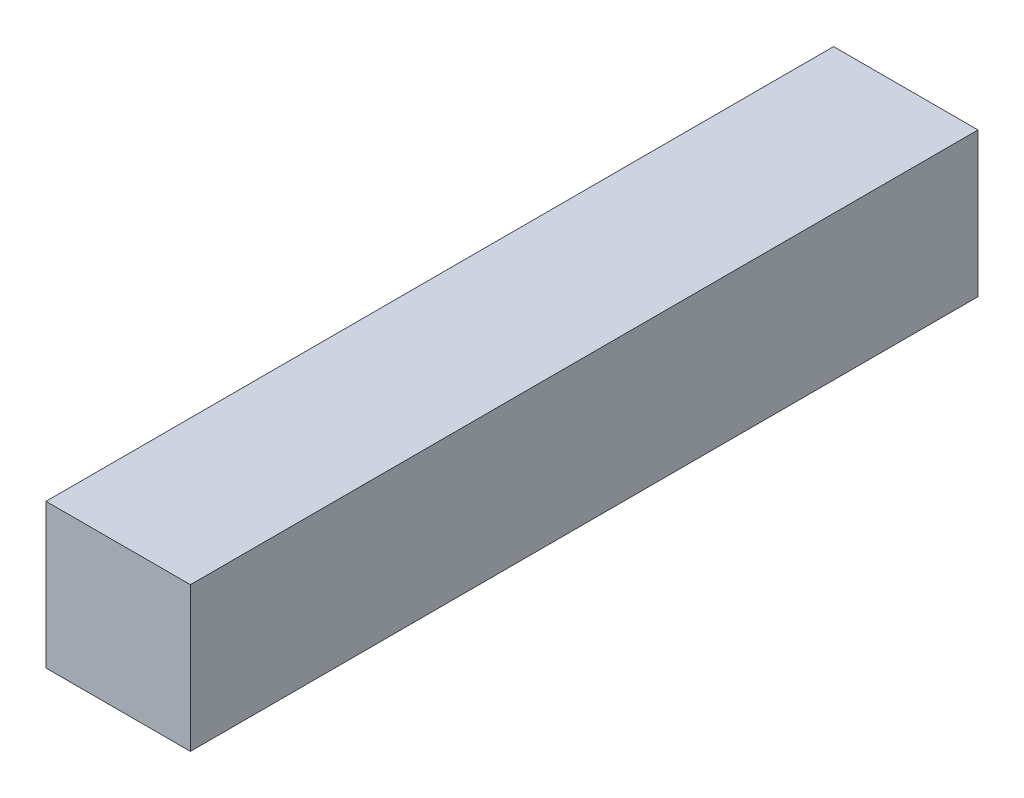
ISO-10303-21;
HEADER;
FILE_DESCRIPTION(('STEP AP214'),'2;1');
FILE_NAME('part.step','',(''),(''),'','','');
FILE_SCHEMA(('AUTOMOTIVE_DESIGN { 1 0 10303 214 1 1 1 1 }'));
ENDSEC;
DATA;
#1=APPLICATION_CONTEXT('core data for automotive mechanical design processes');
#2=APPLICATION_PROTOCOL_DEFINITION('international standard','automotive_design',2000,#1);
#3=PRODUCT_CONTEXT('',#1,'mechanical');
#4=PRODUCT('Part','Part','',(#3));
#5=PRODUCT_RELATED_PRODUCT_CATEGORY('part','',(#4));
#6=PRODUCT_DEFINITION_FORMATION('','',#4);
#7=PRODUCT_DEFINITION_CONTEXT('part definition',#1,'design');
#8=PRODUCT_DEFINITION('design','',#6,#7);
#9=PRODUCT_DEFINITION_SHAPE('','',#8);
#10=(LENGTH_UNIT() NAMED_UNIT(*) SI_UNIT(.MILLI.,.METRE.));
#11=(NAMED_UNIT(*) PLANE_ANGLE_UNIT() SI_UNIT($,.RADIAN.));
#12=(NAMED_UNIT(*) SI_UNIT($,.STERADIAN.) SOLID_ANGLE_UNIT());
#13=UNCERTAINTY_MEASURE_WITH_UNIT(LENGTH_MEASURE(1.E-05),#10,'distance_accuracy_value','');
#14=(GEOMETRIC_REPRESENTATION_CONTEXT(3) GLOBAL_UNCERTAINTY_ASSIGNED_CONTEXT((#13)) GLOBAL_UNIT_ASSIGNED_CONTEXT((#10,
#11,#12)) REPRESENTATION_CONTEXT('',''));
#15=CARTESIAN_POINT('',(0.,0.,0.));
#16=DIRECTION('',(0.,0.,1.));
#17=DIRECTION('',(1.,0.,0.));
#18=AXIS2_PLACEMENT_3D('',#15,#16,#17);
#19=CARTESIAN_POINT('',(-6.35,-6.35,381.));
#20=DIRECTION('',(0.,1.,0.));
#21=DIRECTION('',(0.,0.,1.));
#22=AXIS2_PLACEMENT_3D('',#19,#20,#21);
#23=PLANE('',#22);
#24=CARTESIAN_POINT('',(28.575,-6.35,349.25));
#25=DIRECTION('',(0.,-1.,0.));
#26=DIRECTION('',(0.,0.,-1.));
#27=AXIS2_PLACEMENT_3D('',#24,#25,#26);
#28=CIRCLE('',#27,6.35);
#29=CARTESIAN_POINT('',(28.575,-6.35,342.9));
#30=VERTEX_POINT('',#29);
#31=EDGE_CURVE('E212',#30,#30,#28,.T.);
#32=ORIENTED_EDGE('',*,*,#31,.F.);
#33=EDGE_LOOP('',(#32));
#34=FACE_BOUND('',#33,.T.);
#35=DIRECTION('',(1.,0.,0.));
#36=VECTOR('',#35,1.);
#37=CARTESIAN_POINT('',(-6.35,-6.35,0.));
#38=LINE('',#37,#36);
#39=CARTESIAN_POINT('',(-6.35,-6.35,0.));
#40=VERTEX_POINT('',#39);
#41=CARTESIAN_POINT('',(63.5,-6.35,0.));
#42=VERTEX_POINT('',#41);
#43=EDGE_CURVE('E161',#40,#42,#38,.T.);
#44=ORIENTED_EDGE('',*,*,#43,.T.);
#45=DIRECTION('',(0.,0.,-1.));
#46=VECTOR('',#45,1.);
#47=CARTESIAN_POINT('',(63.5,-6.35,381.));
#48=LINE('',#47,#46);
#49=CARTESIAN_POINT('',(63.5,-6.35,381.));
#50=VERTEX_POINT('',#49);
#51=EDGE_CURVE('E12',#50,#42,#48,.T.);
#52=ORIENTED_EDGE('',*,*,#51,.F.);
#53=DIRECTION('',(1.,0.,0.));
#54=VECTOR('',#53,1.);
#55=CARTESIAN_POINT('',(-6.35,-6.35,381.));
#56=LINE('',#55,#54);
#57=CARTESIAN_POINT('',(-6.35,-6.35,381.));
#58=VERTEX_POINT('',#57);
#59=EDGE_CURVE('E162',#58,#50,#56,.T.);
#60=ORIENTED_EDGE('',*,*,#59,.F.);
#61=DIRECTION('',(0.,0.,-1.));
#62=VECTOR('',#61,1.);
#63=CARTESIAN_POINT('',(-6.35,-6.35,381.));
#64=LINE('',#63,#62);
#65=EDGE_CURVE('E65',#58,#40,#64,.T.);
#66=ORIENTED_EDGE('',*,*,#65,.T.);
#67=EDGE_LOOP('',(#44,#52,#60,#66));
#68=FACE_BOUND('',#67,.T.);
#69=ADVANCED_FACE('F41',(#34,#68),#23,.F.);
#70=CARTESIAN_POINT('',(63.5,-6.35,381.));
#71=DIRECTION('',(-1.,0.,0.));
#72=DIRECTION('',(0.,0.,1.));
#73=AXIS2_PLACEMENT_3D('',#70,#71,#72);
#74=PLANE('',#73);
#75=DIRECTION('',(0.,1.,0.));
#76=VECTOR('',#75,1.);
#77=CARTESIAN_POINT('',(63.5,-6.35,0.));
#78=LINE('',#77,#76);
#79=CARTESIAN_POINT('',(63.5,63.5,0.));
#80=VERTEX_POINT('',#79);
#81=EDGE_CURVE('E177',#42,#80,#78,.T.);
#82=ORIENTED_EDGE('',*,*,#81,.T.);
#83=DIRECTION('',(0.,0.,-1.));
#84=VECTOR('',#83,1.);
#85=CARTESIAN_POINT('',(63.5,63.5,381.));
#86=LINE('',#85,#84);
#87=CARTESIAN_POINT('',(63.5,63.5,381.));
#88=VERTEX_POINT('',#87);
#89=EDGE_CURVE('E49',#88,#80,#86,.T.);
#90=ORIENTED_EDGE('',*,*,#89,.F.);
#91=DIRECTION('',(0.,1.,0.));
#92=VECTOR('',#91,1.);
#93=CARTESIAN_POINT('',(63.5,-6.35,381.));
#94=LINE('',#93,#92);
#95=EDGE_CURVE('E91',#50,#88,#94,.T.);
#96=ORIENTED_EDGE('',*,*,#95,.F.);
#97=ORIENTED_EDGE('',*,*,#51,.T.);
#98=EDGE_LOOP('',(#82,#90,#96,#97));
#99=FACE_BOUND('',#98,.T.);
#100=ADVANCED_FACE('F197',(#99),#74,.F.);
#101=CARTESIAN_POINT('',(-6.35,63.5,381.));
#102=DIRECTION('',(0.,1.,0.));
#103=DIRECTION('',(0.,0.,1.));
#104=AXIS2_PLACEMENT_3D('',#101,#102,#103);
#105=PLANE('',#104);
#106=DIRECTION('',(1.,0.,0.));
#107=VECTOR('',#106,1.);
#108=CARTESIAN_POINT('',(-6.35,63.5,0.));
#109=LINE('',#108,#107);
#110=CARTESIAN_POINT('',(-6.35,63.5,0.));
#111=VERTEX_POINT('',#110);
#112=EDGE_CURVE('E181',#111,#80,#109,.T.);
#113=ORIENTED_EDGE('',*,*,#112,.F.);
#114=DIRECTION('',(0.,0.,-1.));
#115=VECTOR('',#114,1.);
#116=CARTESIAN_POINT('',(-6.35,63.5,381.));
#117=LINE('',#116,#115);
#118=CARTESIAN_POINT('',(-6.35,63.5,381.));
#119=VERTEX_POINT('',#118);
#120=EDGE_CURVE('E190',#119,#111,#117,.T.);
#121=ORIENTED_EDGE('',*,*,#120,.F.);
#122=DIRECTION('',(1.,0.,0.));
#123=VECTOR('',#122,1.);
#124=CARTESIAN_POINT('',(-6.35,63.5,381.));
#125=LINE('',#124,#123);
#126=EDGE_CURVE('E168',#119,#88,#125,.T.);
#127=ORIENTED_EDGE('',*,*,#126,.T.);
#128=ORIENTED_EDGE('',*,*,#89,.T.);
#129=EDGE_LOOP('',(#113,#121,#127,#128));
#130=FACE_BOUND('',#129,.T.);
#131=ADVANCED_FACE('F195',(#130),#105,.T.);
#132=CARTESIAN_POINT('',(-6.35,-6.35,381.));
#133=DIRECTION('',(-1.,0.,0.));
#134=DIRECTION('',(0.,0.,1.));
#135=AXIS2_PLACEMENT_3D('',#132,#133,#134);
#136=PLANE('',#135);
#137=DIRECTION('',(0.,1.,0.));
#138=VECTOR('',#137,1.);
#139=CARTESIAN_POINT('',(-6.35,-6.35,0.));
#140=LINE('',#139,#138);
#141=EDGE_CURVE('E165',#40,#111,#140,.T.);
#142=ORIENTED_EDGE('',*,*,#141,.F.);
#143=ORIENTED_EDGE('',*,*,#65,.F.);
#144=DIRECTION('',(0.,1.,0.));
#145=VECTOR('',#144,1.);
#146=CARTESIAN_POINT('',(-6.35,-6.35,381.));
#147=LINE('',#146,#145);
#148=EDGE_CURVE('E172',#58,#119,#147,.T.);
#149=ORIENTED_EDGE('',*,*,#148,.T.);
#150=ORIENTED_EDGE('',*,*,#120,.T.);
#151=EDGE_LOOP('',(#142,#143,#149,#150));
#152=FACE_BOUND('',#151,.T.);
#153=ADVANCED_FACE('F201',(#152),#136,.T.);
#154=CARTESIAN_POINT('',(0.,0.,381.));
#155=DIRECTION('',(0.,0.,1.));
#156=DIRECTION('',(1.,0.,0.));
#157=AXIS2_PLACEMENT_3D('',#154,#155,#156);
#158=PLANE('',#157);
#159=ORIENTED_EDGE('',*,*,#59,.T.);
#160=ORIENTED_EDGE('',*,*,#95,.T.);
#161=ORIENTED_EDGE('',*,*,#126,.F.);
#162=ORIENTED_EDGE('',*,*,#148,.F.);
#163=EDGE_LOOP('',(#159,#160,#161,#162));
#164=FACE_BOUND('',#163,.T.);
#165=ADVANCED_FACE('F204',(#164),#158,.T.);
#166=CARTESIAN_POINT('',(0.,0.,0.));
#167=DIRECTION('',(0.,0.,1.));
#168=DIRECTION('',(1.,0.,0.));
#169=AXIS2_PLACEMENT_3D('',#166,#167,#168);
#170=PLANE('',#169);
#171=DIRECTION('',(0.,1.,0.));
#172=VECTOR('',#171,1.);
#173=CARTESIAN_POINT('',(57.15,0.,0.));
#174=LINE('',#173,#172);
#175=CARTESIAN_POINT('',(57.15,0.,0.));
#176=VERTEX_POINT('',#175);
#177=CARTESIAN_POINT('',(57.15,57.15,0.));
#178=VERTEX_POINT('',#177);
#179=EDGE_CURVE('E156',#176,#178,#174,.T.);
#180=ORIENTED_EDGE('',*,*,#179,.T.);
#181=DIRECTION('',(1.,0.,0.));
#182=VECTOR('',#181,1.);
#183=CARTESIAN_POINT('',(0.,57.15,0.));
#184=LINE('',#183,#182);
#185=CARTESIAN_POINT('',(0.,57.15,0.));
#186=VERTEX_POINT('',#185);
#187=EDGE_CURVE('E134',#186,#178,#184,.T.);
#188=ORIENTED_EDGE('',*,*,#187,.F.);
#189=DIRECTION('',(0.,1.,0.));
#190=VECTOR('',#189,1.);
#191=CARTESIAN_POINT('',(0.,0.,0.));
#192=LINE('',#191,#190);
#193=CARTESIAN_POINT('',(0.,0.,0.));
#194=VERTEX_POINT('',#193);
#195=EDGE_CURVE('E126',#194,#186,#192,.T.);
#196=ORIENTED_EDGE('',*,*,#195,.F.);
#197=DIRECTION('',(1.,0.,0.));
#198=VECTOR('',#197,1.);
#199=CARTESIAN_POINT('',(0.,0.,0.));
#200=LINE('',#199,#198);
#201=EDGE_CURVE('E56',#194,#176,#200,.T.);
#202=ORIENTED_EDGE('',*,*,#201,.T.);
#203=EDGE_LOOP('',(#180,#188,#196,#202));
#204=FACE_BOUND('',#203,.T.);
#205=ORIENTED_EDGE('',*,*,#43,.F.);
#206=ORIENTED_EDGE('',*,*,#141,.T.);
#207=ORIENTED_EDGE('',*,*,#112,.T.);
#208=ORIENTED_EDGE('',*,*,#81,.F.);
#209=EDGE_LOOP('',(#205,#206,#207,#208));
#210=FACE_BOUND('',#209,.T.);
#211=ADVANCED_FACE('F200',(#204,#210),#170,.F.);
#212=CARTESIAN_POINT('',(0.,0.,374.65));
#213=DIRECTION('',(0.,0.,1.));
#214=DIRECTION('',(1.,0.,0.));
#215=AXIS2_PLACEMENT_3D('',#212,#213,#214);
#216=PLANE('',#215);
#217=DIRECTION('',(0.,1.,0.));
#218=VECTOR('',#217,1.);
#219=CARTESIAN_POINT('',(0.,0.,374.65));
#220=LINE('',#219,#218);
#221=CARTESIAN_POINT('',(0.,0.,374.65));
#222=VERTEX_POINT('',#221);
#223=CARTESIAN_POINT('',(0.,57.15,374.65));
#224=VERTEX_POINT('',#223);
#225=EDGE_CURVE('E139',#222,#224,#220,.T.);
#226=ORIENTED_EDGE('',*,*,#225,.T.);
#227=DIRECTION('',(1.,0.,0.));
#228=VECTOR('',#227,1.);
#229=CARTESIAN_POINT('',(0.,57.15,374.65));
#230=LINE('',#229,#228);
#231=CARTESIAN_POINT('',(57.15,57.15,374.65));
#232=VERTEX_POINT('',#231);
#233=EDGE_CURVE('E131',#224,#232,#230,.T.);
#234=ORIENTED_EDGE('',*,*,#233,.T.);
#235=DIRECTION('',(0.,1.,0.));
#236=VECTOR('',#235,1.);
#237=CARTESIAN_POINT('',(57.15,0.,374.65));
#238=LINE('',#237,#236);
#239=CARTESIAN_POINT('',(57.15,0.,374.65));
#240=VERTEX_POINT('',#239);
#241=EDGE_CURVE('E115',#240,#232,#238,.T.);
#242=ORIENTED_EDGE('',*,*,#241,.F.);
#243=DIRECTION('',(1.,0.,0.));
#244=VECTOR('',#243,1.);
#245=CARTESIAN_POINT('',(0.,0.,374.65));
#246=LINE('',#245,#244);
#247=EDGE_CURVE('E127',#222,#240,#246,.T.);
#248=ORIENTED_EDGE('',*,*,#247,.F.);
#249=EDGE_LOOP('',(#226,#234,#242,#248));
#250=FACE_BOUND('',#249,.T.);
#251=ADVANCED_FACE('F138',(#250),#216,.F.);
#252=CARTESIAN_POINT('',(0.,57.15,461.822305089622));
#253=DIRECTION('',(0.,1.,0.));
#254=DIRECTION('',(0.,0.,1.));
#255=AXIS2_PLACEMENT_3D('',#252,#253,#254);
#256=PLANE('',#255);
#257=DIRECTION('',(0.,0.,-1.));
#258=VECTOR('',#257,1.);
#259=CARTESIAN_POINT('',(0.,57.15,461.822305089622));
#260=LINE('',#259,#258);
#261=EDGE_CURVE('E149',#224,#186,#260,.T.);
#262=ORIENTED_EDGE('',*,*,#261,.T.);
#263=ORIENTED_EDGE('',*,*,#187,.T.);
#264=DIRECTION('',(0.,0.,-1.));
#265=VECTOR('',#264,1.);
#266=CARTESIAN_POINT('',(57.15,57.15,461.822305089622));
#267=LINE('',#266,#265);
#268=EDGE_CURVE('E119',#232,#178,#267,.T.);
#269=ORIENTED_EDGE('',*,*,#268,.F.);
#270=ORIENTED_EDGE('',*,*,#233,.F.);
#271=EDGE_LOOP('',(#262,#263,#269,#270));
#272=FACE_BOUND('',#271,.T.);
#273=ADVANCED_FACE('F130',(#272),#256,.F.);
#274=CARTESIAN_POINT('',(57.15,0.,461.822305089622));
#275=DIRECTION('',(-1.,0.,0.));
#276=DIRECTION('',(0.,0.,1.));
#277=AXIS2_PLACEMENT_3D('',#274,#275,#276);
#278=PLANE('',#277);
#279=ORIENTED_EDGE('',*,*,#241,.T.);
#280=ORIENTED_EDGE('',*,*,#268,.T.);
#281=ORIENTED_EDGE('',*,*,#179,.F.);
#282=DIRECTION('',(0.,0.,-1.));
#283=VECTOR('',#282,1.);
#284=CARTESIAN_POINT('',(57.15,0.,461.822305089622));
#285=LINE('',#284,#283);
#286=EDGE_CURVE('E121',#240,#176,#285,.T.);
#287=ORIENTED_EDGE('',*,*,#286,.F.);
#288=EDGE_LOOP('',(#279,#280,#281,#287));
#289=FACE_BOUND('',#288,.T.);
#290=ADVANCED_FACE('F117',(#289),#278,.T.);
#291=CARTESIAN_POINT('',(0.,0.,461.822305089622));
#292=DIRECTION('',(0.,1.,0.));
#293=DIRECTION('',(0.,0.,1.));
#294=AXIS2_PLACEMENT_3D('',#291,#292,#293);
#295=PLANE('',#294);
#296=CARTESIAN_POINT('',(28.575,0.,349.25));
#297=DIRECTION('',(0.,1.,0.));
#298=DIRECTION('',(0.,0.,1.));
#299=AXIS2_PLACEMENT_3D('',#296,#297,#298);
#300=CIRCLE('',#299,6.35);
#301=CARTESIAN_POINT('',(28.575,0.,355.6));
#302=VERTEX_POINT('',#301);
#303=EDGE_CURVE('E151',#302,#302,#300,.F.);
#304=ORIENTED_EDGE('',*,*,#303,.T.);
#305=EDGE_LOOP('',(#304));
#306=FACE_BOUND('',#305,.T.);
#307=ORIENTED_EDGE('',*,*,#247,.T.);
#308=ORIENTED_EDGE('',*,*,#286,.T.);
#309=ORIENTED_EDGE('',*,*,#201,.F.);
#310=DIRECTION('',(0.,0.,-1.));
#311=VECTOR('',#310,1.);
#312=CARTESIAN_POINT('',(0.,0.,461.822305089622));
#313=LINE('',#312,#311);
#314=EDGE_CURVE('E153',#222,#194,#313,.T.);
#315=ORIENTED_EDGE('',*,*,#314,.F.);
#316=EDGE_LOOP('',(#307,#308,#309,#315));
#317=FACE_BOUND('',#316,.T.);
#318=ADVANCED_FACE('F229',(#306,#317),#295,.T.);
#319=CARTESIAN_POINT('',(0.,0.,461.822305089622));
#320=DIRECTION('',(-1.,0.,0.));
#321=DIRECTION('',(0.,0.,1.));
#322=AXIS2_PLACEMENT_3D('',#319,#320,#321);
#323=PLANE('',#322);
#324=ORIENTED_EDGE('',*,*,#314,.T.);
#325=ORIENTED_EDGE('',*,*,#195,.T.);
#326=ORIENTED_EDGE('',*,*,#261,.F.);
#327=ORIENTED_EDGE('',*,*,#225,.F.);
#328=EDGE_LOOP('',(#324,#325,#326,#327));
#329=FACE_BOUND('',#328,.T.);
#330=ADVANCED_FACE('F228',(#329),#323,.F.);
#331=CARTESIAN_POINT('',(28.575,17.9605122421383,349.25));
#332=DIRECTION('',(0.,-1.,0.));
#333=DIRECTION('',(0.,0.,-1.));
#334=AXIS2_PLACEMENT_3D('',#331,#332,#333);
#335=CYLINDRICAL_SURFACE('',#334,6.35);
#336=ORIENTED_EDGE('',*,*,#31,.T.);
#337=EDGE_LOOP('',(#336));
#338=FACE_BOUND('',#337,.T.);
#339=ORIENTED_EDGE('',*,*,#303,.F.);
#340=EDGE_LOOP('',(#339));
#341=FACE_BOUND('',#340,.T.);
#342=ADVANCED_FACE('F237',(#338,#341),#335,.F.);
#343=CLOSED_SHELL('',(#69,#100,#131,#153,#165,#211,#251,#273,#290,#318,#330,#342));
#344=MANIFOLD_SOLID_BREP('B2',#343);
#345=ADVANCED_BREP_SHAPE_REPRESENTATION('',(#18,#344),#14);
#346=SHAPE_DEFINITION_REPRESENTATION(#9,#345);
ENDSEC;
END-ISO-10303-21;
